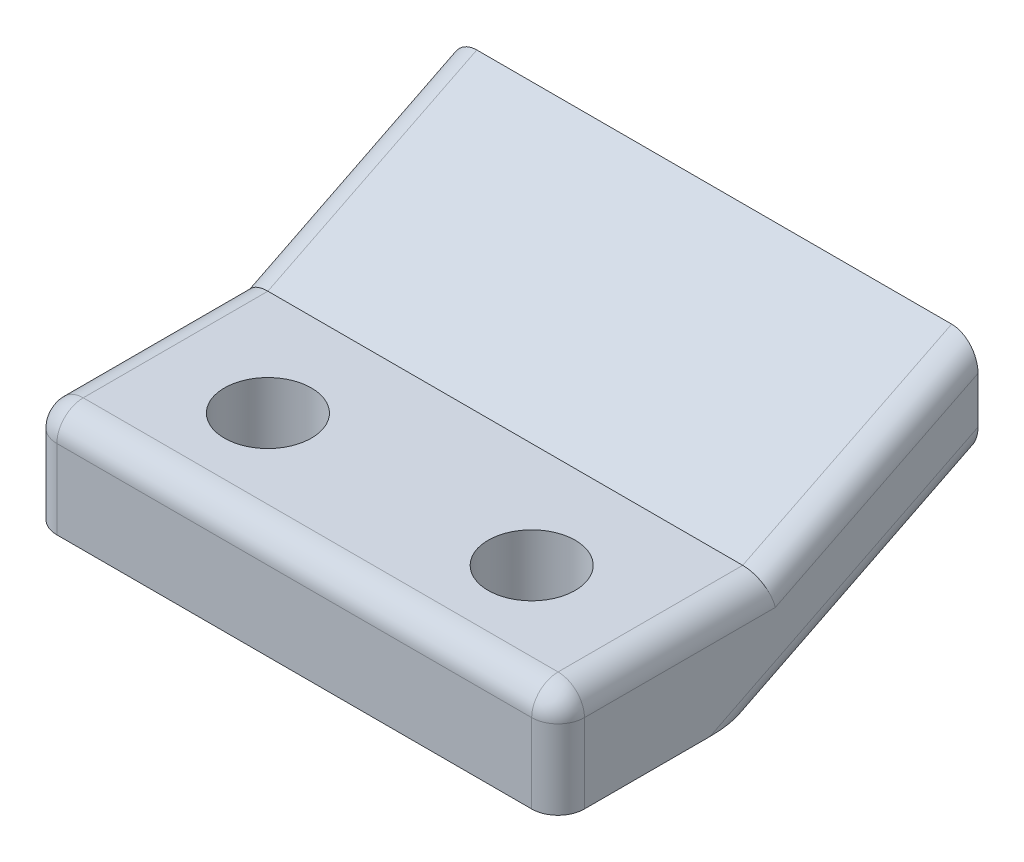
ISO-10303-21;
HEADER;
FILE_DESCRIPTION(('STEP AP214'),'2;1');
FILE_NAME('part.step','',(''),(''),'','','');
FILE_SCHEMA(('AUTOMOTIVE_DESIGN { 1 0 10303 214 1 1 1 1 }'));
ENDSEC;
DATA;
#1=APPLICATION_CONTEXT('core data for automotive mechanical design processes');
#2=APPLICATION_PROTOCOL_DEFINITION('international standard','automotive_design',2000,#1);
#3=PRODUCT_CONTEXT('',#1,'mechanical');
#4=PRODUCT('Part','Part','',(#3));
#5=PRODUCT_RELATED_PRODUCT_CATEGORY('part','',(#4));
#6=PRODUCT_DEFINITION_FORMATION('','',#4);
#7=PRODUCT_DEFINITION_CONTEXT('part definition',#1,'design');
#8=PRODUCT_DEFINITION('design','',#6,#7);
#9=PRODUCT_DEFINITION_SHAPE('','',#8);
#10=(LENGTH_UNIT() NAMED_UNIT(*) SI_UNIT(.MILLI.,.METRE.));
#11=(NAMED_UNIT(*) PLANE_ANGLE_UNIT() SI_UNIT($,.RADIAN.));
#12=(NAMED_UNIT(*) SI_UNIT($,.STERADIAN.) SOLID_ANGLE_UNIT());
#13=UNCERTAINTY_MEASURE_WITH_UNIT(LENGTH_MEASURE(1.E-05),#10,'distance_accuracy_value','');
#14=(GEOMETRIC_REPRESENTATION_CONTEXT(3) GLOBAL_UNCERTAINTY_ASSIGNED_CONTEXT((#13)) GLOBAL_UNIT_ASSIGNED_CONTEXT((#10,
#11,#12)) REPRESENTATION_CONTEXT('',''));
#15=CARTESIAN_POINT('',(0.,0.,0.));
#16=DIRECTION('',(0.,0.,1.));
#17=DIRECTION('',(1.,0.,0.));
#18=AXIS2_PLACEMENT_3D('',#15,#16,#17);
#19=CARTESIAN_POINT('',(20.,0.,0.));
#20=DIRECTION('',(0.,-0.894427190999916,-0.447213595499958));
#21=DIRECTION('',(0.,0.447213595499958,-0.894427190999916));
#22=AXIS2_PLACEMENT_3D('',#19,#20,#21);
#23=PLANE('',#22);
#24=DIRECTION('',(1.,0.,0.));
#25=VECTOR('',#24,1.);
#26=CARTESIAN_POINT('',(0.,4.,-8.));
#27=LINE('',#26,#25);
#28=CARTESIAN_POINT('',(1.,4.,-8.));
#29=VERTEX_POINT('',#28);
#30=CARTESIAN_POINT('',(19.,4.,-8.));
#31=VERTEX_POINT('',#30);
#32=EDGE_CURVE('E221',#29,#31,#27,.T.);
#33=ORIENTED_EDGE('',*,*,#32,.T.);
#34=DIRECTION('',(0.,-0.447213595499958,0.894427190999916));
#35=VECTOR('',#34,1.);
#36=CARTESIAN_POINT('',(19.,7.96,-15.92));
#37=LINE('',#36,#35);
#38=CARTESIAN_POINT('',(19.,7.96,-15.92));
#39=VERTEX_POINT('',#38);
#40=EDGE_CURVE('E176',#31,#39,#37,.F.);
#41=ORIENTED_EDGE('',*,*,#40,.T.);
#42=DIRECTION('',(-1.,0.,0.));
#43=VECTOR('',#42,1.);
#44=CARTESIAN_POINT('',(20.,7.96,-15.92));
#45=LINE('',#44,#43);
#46=CARTESIAN_POINT('',(1.,7.96,-15.92));
#47=VERTEX_POINT('',#46);
#48=EDGE_CURVE('E234',#39,#47,#45,.T.);
#49=ORIENTED_EDGE('',*,*,#48,.T.);
#50=DIRECTION('',(0.,-0.447213595499958,0.894427190999916));
#51=VECTOR('',#50,1.);
#52=CARTESIAN_POINT('',(1.,0.,0.));
#53=LINE('',#52,#51);
#54=EDGE_CURVE('E174',#47,#29,#53,.T.);
#55=ORIENTED_EDGE('',*,*,#54,.T.);
#56=EDGE_LOOP('',(#33,#41,#49,#55));
#57=FACE_BOUND('',#56,.T.);
#58=ADVANCED_FACE('F37',(#57),#23,.F.);
#59=CARTESIAN_POINT('',(20.,0.,-8.));
#60=DIRECTION('',(0.,1.,0.));
#61=DIRECTION('',(0.,0.,1.));
#62=AXIS2_PLACEMENT_3D('',#59,#60,#61);
#63=PLANE('',#62);
#64=CARTESIAN_POINT('',(5.,0.,-4.));
#65=DIRECTION('',(0.,-1.,0.));
#66=DIRECTION('',(0.,0.,-1.));
#67=AXIS2_PLACEMENT_3D('',#64,#65,#66);
#68=CIRCLE('',#67,1.65);
#69=CARTESIAN_POINT('',(5.,0.,-5.65));
#70=VERTEX_POINT('',#69);
#71=EDGE_CURVE('E213',#70,#70,#68,.T.);
#72=ORIENTED_EDGE('',*,*,#71,.F.);
#73=EDGE_LOOP('',(#72));
#74=FACE_BOUND('',#73,.T.);
#75=CARTESIAN_POINT('',(15.,0.,-4.));
#76=DIRECTION('',(0.,-1.,0.));
#77=DIRECTION('',(0.,0.,-1.));
#78=AXIS2_PLACEMENT_3D('',#75,#76,#77);
#79=CIRCLE('',#78,1.65);
#80=CARTESIAN_POINT('',(15.,0.,-5.65));
#81=VERTEX_POINT('',#80);
#82=EDGE_CURVE('E207',#81,#81,#79,.T.);
#83=ORIENTED_EDGE('',*,*,#82,.F.);
#84=EDGE_LOOP('',(#83));
#85=FACE_BOUND('',#84,.T.);
#86=DIRECTION('',(-1.,0.,0.));
#87=VECTOR('',#86,1.);
#88=CARTESIAN_POINT('',(20.,0.,-8.));
#89=LINE('',#88,#87);
#90=CARTESIAN_POINT('',(19.,0.,-8.));
#91=VERTEX_POINT('',#90);
#92=CARTESIAN_POINT('',(1.,0.,-8.));
#93=VERTEX_POINT('',#92);
#94=EDGE_CURVE('E144',#91,#93,#89,.T.);
#95=ORIENTED_EDGE('',*,*,#94,.F.);
#96=CARTESIAN_POINT('',(19.,0.,-5.76393202250021));
#97=DIRECTION('',(0.,1.,0.));
#98=DIRECTION('',(0.,0.,1.));
#99=AXIS2_PLACEMENT_3D('',#96,#97,#98);
#100=ELLIPSE('',#99,2.23606797749979,1.);
#101=CARTESIAN_POINT('',(20.,0.,-5.76393202250021));
#102=VERTEX_POINT('',#101);
#103=EDGE_CURVE('E152',#91,#102,#100,.F.);
#104=ORIENTED_EDGE('',*,*,#103,.T.);
#105=DIRECTION('',(0.,0.,-1.));
#106=VECTOR('',#105,1.);
#107=CARTESIAN_POINT('',(20.,0.,-8.));
#108=LINE('',#107,#106);
#109=CARTESIAN_POINT('',(20.,0.,-1.));
#110=VERTEX_POINT('',#109);
#111=EDGE_CURVE('E135',#110,#102,#108,.T.);
#112=ORIENTED_EDGE('',*,*,#111,.F.);
#113=CARTESIAN_POINT('',(19.,0.,-1.));
#114=DIRECTION('',(0.,1.,0.));
#115=DIRECTION('',(0.,0.,1.));
#116=AXIS2_PLACEMENT_3D('',#113,#114,#115);
#117=CIRCLE('',#116,1.);
#118=CARTESIAN_POINT('',(19.,0.,0.));
#119=VERTEX_POINT('',#118);
#120=EDGE_CURVE('E150',#110,#119,#117,.F.);
#121=ORIENTED_EDGE('',*,*,#120,.T.);
#122=DIRECTION('',(-1.,0.,0.));
#123=VECTOR('',#122,1.);
#124=CARTESIAN_POINT('',(20.,0.,0.));
#125=LINE('',#124,#123);
#126=CARTESIAN_POINT('',(1.,0.,0.));
#127=VERTEX_POINT('',#126);
#128=EDGE_CURVE('E228',#119,#127,#125,.T.);
#129=ORIENTED_EDGE('',*,*,#128,.T.);
#130=CARTESIAN_POINT('',(1.,0.,-1.));
#131=DIRECTION('',(0.,1.,0.));
#132=DIRECTION('',(0.,0.,1.));
#133=AXIS2_PLACEMENT_3D('',#130,#131,#132);
#134=CIRCLE('',#133,1.);
#135=CARTESIAN_POINT('',(0.,0.,-1.));
#136=VERTEX_POINT('',#135);
#137=EDGE_CURVE('E158',#127,#136,#134,.F.);
#138=ORIENTED_EDGE('',*,*,#137,.T.);
#139=DIRECTION('',(0.,0.,-1.));
#140=VECTOR('',#139,1.);
#141=CARTESIAN_POINT('',(0.,0.,-8.));
#142=LINE('',#141,#140);
#143=CARTESIAN_POINT('',(0.,0.,-5.76393202250021));
#144=VERTEX_POINT('',#143);
#145=EDGE_CURVE('E223',#136,#144,#142,.T.);
#146=ORIENTED_EDGE('',*,*,#145,.T.);
#147=CARTESIAN_POINT('',(1.,0.,-5.76393202250021));
#148=DIRECTION('',(0.,1.,0.));
#149=DIRECTION('',(0.,0.,-1.));
#150=AXIS2_PLACEMENT_3D('',#147,#148,#149);
#151=ELLIPSE('',#150,2.23606797749979,1.);
#152=EDGE_CURVE('E157',#144,#93,#151,.F.);
#153=ORIENTED_EDGE('',*,*,#152,.T.);
#154=EDGE_LOOP('',(#95,#104,#112,#121,#129,#138,#146,#153));
#155=FACE_BOUND('',#154,.T.);
#156=ADVANCED_FACE('F148',(#74,#85,#155),#63,.F.);
#157=CARTESIAN_POINT('',(20.,3.96,-15.92));
#158=DIRECTION('',(0.,0.894427190999916,0.447213595499958));
#159=DIRECTION('',(0.,-0.447213595499958,0.894427190999916));
#160=AXIS2_PLACEMENT_3D('',#157,#158,#159);
#161=PLANE('',#160);
#162=DIRECTION('',(-1.,0.,0.));
#163=VECTOR('',#162,1.);
#164=CARTESIAN_POINT('',(20.,3.96,-15.92));
#165=LINE('',#164,#163);
#166=CARTESIAN_POINT('',(19.,3.96,-15.92));
#167=VERTEX_POINT('',#166);
#168=CARTESIAN_POINT('',(1.,3.96,-15.92));
#169=VERTEX_POINT('',#168);
#170=EDGE_CURVE('E237',#167,#169,#165,.T.);
#171=ORIENTED_EDGE('',*,*,#170,.F.);
#172=DIRECTION('',(0.,0.447213595499958,-0.894427190999916));
#173=VECTOR('',#172,1.);
#174=CARTESIAN_POINT('',(19.,0.,-8.));
#175=LINE('',#174,#173);
#176=EDGE_CURVE('E161',#167,#91,#175,.F.);
#177=ORIENTED_EDGE('',*,*,#176,.T.);
#178=ORIENTED_EDGE('',*,*,#94,.T.);
#179=DIRECTION('',(0.,0.447213595499958,-0.894427190999916));
#180=VECTOR('',#179,1.);
#181=CARTESIAN_POINT('',(1.,3.96,-15.92));
#182=LINE('',#181,#180);
#183=EDGE_CURVE('E259',#93,#169,#182,.T.);
#184=ORIENTED_EDGE('',*,*,#183,.T.);
#185=EDGE_LOOP('',(#171,#177,#178,#184));
#186=FACE_BOUND('',#185,.T.);
#187=ADVANCED_FACE('F264',(#186),#161,.F.);
#188=CARTESIAN_POINT('',(20.,7.96,-15.92));
#189=DIRECTION('',(0.,0.,1.));
#190=DIRECTION('',(0.,-1.,0.));
#191=AXIS2_PLACEMENT_3D('',#188,#189,#190);
#192=PLANE('',#191);
#193=DIRECTION('',(0.,1.,0.));
#194=VECTOR('',#193,1.);
#195=CARTESIAN_POINT('',(20.,7.96,-15.92));
#196=LINE('',#195,#194);
#197=CARTESIAN_POINT('',(20.,5.0780339887499,-15.92));
#198=VERTEX_POINT('',#197);
#199=CARTESIAN_POINT('',(20.,6.84196601125011,-15.92));
#200=VERTEX_POINT('',#199);
#201=EDGE_CURVE('E153',#198,#200,#196,.T.);
#202=ORIENTED_EDGE('',*,*,#201,.F.);
#203=CARTESIAN_POINT('',(19.,5.0780339887499,-15.92));
#204=DIRECTION('',(0.,0.,1.));
#205=DIRECTION('',(0.,-1.,0.));
#206=AXIS2_PLACEMENT_3D('',#203,#204,#205);
#207=ELLIPSE('',#206,1.11803398874989,1.);
#208=EDGE_CURVE('E257',#198,#167,#207,.F.);
#209=ORIENTED_EDGE('',*,*,#208,.T.);
#210=ORIENTED_EDGE('',*,*,#170,.T.);
#211=CARTESIAN_POINT('',(1.,5.0780339887499,-15.92));
#212=DIRECTION('',(0.,0.,1.));
#213=DIRECTION('',(0.,1.,0.));
#214=AXIS2_PLACEMENT_3D('',#211,#212,#213);
#215=ELLIPSE('',#214,1.11803398874989,1.);
#216=CARTESIAN_POINT('',(0.,5.0780339887499,-15.92));
#217=VERTEX_POINT('',#216);
#218=EDGE_CURVE('E255',#169,#217,#215,.F.);
#219=ORIENTED_EDGE('',*,*,#218,.T.);
#220=DIRECTION('',(0.,1.,0.));
#221=VECTOR('',#220,1.);
#222=CARTESIAN_POINT('',(0.,7.96,-15.92));
#223=LINE('',#222,#221);
#224=CARTESIAN_POINT('',(0.,6.84196601125011,-15.92));
#225=VERTEX_POINT('',#224);
#226=EDGE_CURVE('E154',#217,#225,#223,.T.);
#227=ORIENTED_EDGE('',*,*,#226,.T.);
#228=CARTESIAN_POINT('',(1.,6.84196601125011,-15.92));
#229=DIRECTION('',(0.,0.,1.));
#230=DIRECTION('',(0.,-1.,0.));
#231=AXIS2_PLACEMENT_3D('',#228,#229,#230);
#232=ELLIPSE('',#231,1.11803398874989,1.);
#233=EDGE_CURVE('E251',#225,#47,#232,.F.);
#234=ORIENTED_EDGE('',*,*,#233,.T.);
#235=ORIENTED_EDGE('',*,*,#48,.F.);
#236=CARTESIAN_POINT('',(19.,6.84196601125011,-15.92));
#237=DIRECTION('',(0.,0.,1.));
#238=DIRECTION('',(0.,1.,0.));
#239=AXIS2_PLACEMENT_3D('',#236,#237,#238);
#240=ELLIPSE('',#239,1.11803398874989,1.);
#241=EDGE_CURVE('E253',#39,#200,#240,.F.);
#242=ORIENTED_EDGE('',*,*,#241,.T.);
#243=EDGE_LOOP('',(#202,#209,#210,#219,#227,#234,#235,#242));
#244=FACE_BOUND('',#243,.T.);
#245=ADVANCED_FACE('F272',(#244),#192,.F.);
#246=CARTESIAN_POINT('',(20.,0.,0.));
#247=DIRECTION('',(1.,0.,0.));
#248=DIRECTION('',(0.,0.,-1.));
#249=AXIS2_PLACEMENT_3D('',#246,#247,#248);
#250=PLANE('',#249);
#251=ORIENTED_EDGE('',*,*,#111,.T.);
#252=DIRECTION('',(0.,0.447213595499958,-0.894427190999916));
#253=VECTOR('',#252,1.);
#254=CARTESIAN_POINT('',(20.,4.85442719099992,-15.4727864045001));
#255=LINE('',#254,#253);
#256=EDGE_CURVE('E249',#102,#198,#255,.T.);
#257=ORIENTED_EDGE('',*,*,#256,.T.);
#258=ORIENTED_EDGE('',*,*,#201,.T.);
#259=DIRECTION('',(0.,-0.447213595499958,0.894427190999916));
#260=VECTOR('',#259,1.);
#261=CARTESIAN_POINT('',(20.,3.10557280900008,-8.44721359549996));
#262=LINE('',#261,#260);
#263=CARTESIAN_POINT('',(20.,3.,-8.23606797749979));
#264=VERTEX_POINT('',#263);
#265=EDGE_CURVE('E247',#200,#264,#262,.T.);
#266=ORIENTED_EDGE('',*,*,#265,.T.);
#267=DIRECTION('',(0.,0.,1.));
#268=VECTOR('',#267,1.);
#269=CARTESIAN_POINT('',(20.,3.,0.));
#270=LINE('',#269,#268);
#271=CARTESIAN_POINT('',(20.,3.,-1.));
#272=VERTEX_POINT('',#271);
#273=EDGE_CURVE('E139',#264,#272,#270,.T.);
#274=ORIENTED_EDGE('',*,*,#273,.T.);
#275=DIRECTION('',(0.,-1.,0.));
#276=VECTOR('',#275,1.);
#277=CARTESIAN_POINT('',(20.,0.,-1.));
#278=LINE('',#277,#276);
#279=EDGE_CURVE('E131',#272,#110,#278,.T.);
#280=ORIENTED_EDGE('',*,*,#279,.T.);
#281=EDGE_LOOP('',(#251,#257,#258,#266,#274,#280));
#282=FACE_BOUND('',#281,.T.);
#283=ADVANCED_FACE('F133',(#282),#250,.T.);
#284=CARTESIAN_POINT('',(0.,0.,0.));
#285=DIRECTION('',(1.,0.,0.));
#286=DIRECTION('',(0.,0.,-1.));
#287=AXIS2_PLACEMENT_3D('',#284,#285,#286);
#288=PLANE('',#287);
#289=ORIENTED_EDGE('',*,*,#226,.F.);
#290=DIRECTION('',(0.,0.447213595499958,-0.894427190999916));
#291=VECTOR('',#290,1.);
#292=CARTESIAN_POINT('',(0.,-2.30557280900008,-1.15278640450004));
#293=LINE('',#292,#291);
#294=EDGE_CURVE('E172',#217,#144,#293,.F.);
#295=ORIENTED_EDGE('',*,*,#294,.T.);
#296=ORIENTED_EDGE('',*,*,#145,.F.);
#297=DIRECTION('',(0.,-1.,0.));
#298=VECTOR('',#297,1.);
#299=CARTESIAN_POINT('',(0.,4.,-1.));
#300=LINE('',#299,#298);
#301=CARTESIAN_POINT('',(0.,3.,-1.));
#302=VERTEX_POINT('',#301);
#303=EDGE_CURVE('E166',#136,#302,#300,.F.);
#304=ORIENTED_EDGE('',*,*,#303,.T.);
#305=DIRECTION('',(0.,0.,-1.));
#306=VECTOR('',#305,1.);
#307=CARTESIAN_POINT('',(0.,3.,0.));
#308=LINE('',#307,#306);
#309=CARTESIAN_POINT('',(0.,3.,-8.23606797749979));
#310=VERTEX_POINT('',#309);
#311=EDGE_CURVE('E168',#302,#310,#308,.T.);
#312=ORIENTED_EDGE('',*,*,#311,.T.);
#313=DIRECTION('',(0.,-0.447213595499958,0.894427190999916));
#314=VECTOR('',#313,1.);
#315=CARTESIAN_POINT('',(0.,-0.894427190999915,-0.447213595499958));
#316=LINE('',#315,#314);
#317=EDGE_CURVE('E170',#310,#225,#316,.F.);
#318=ORIENTED_EDGE('',*,*,#317,.T.);
#319=EDGE_LOOP('',(#289,#295,#296,#304,#312,#318));
#320=FACE_BOUND('',#319,.T.);
#321=ADVANCED_FACE('F301',(#320),#288,.F.);
#322=CARTESIAN_POINT('',(0.,4.,0.));
#323=DIRECTION('',(0.,0.,1.));
#324=DIRECTION('',(0.,-1.,0.));
#325=AXIS2_PLACEMENT_3D('',#322,#323,#324);
#326=PLANE('',#325);
#327=ORIENTED_EDGE('',*,*,#128,.F.);
#328=DIRECTION('',(0.,-1.,0.));
#329=VECTOR('',#328,1.);
#330=CARTESIAN_POINT('',(19.,4.,0.));
#331=LINE('',#330,#329);
#332=CARTESIAN_POINT('',(19.,3.,0.));
#333=VERTEX_POINT('',#332);
#334=EDGE_CURVE('E11',#119,#333,#331,.F.);
#335=ORIENTED_EDGE('',*,*,#334,.T.);
#336=DIRECTION('',(-1.,0.,0.));
#337=VECTOR('',#336,1.);
#338=CARTESIAN_POINT('',(0.,3.,0.));
#339=LINE('',#338,#337);
#340=CARTESIAN_POINT('',(1.,3.,0.));
#341=VERTEX_POINT('',#340);
#342=EDGE_CURVE('E53',#333,#341,#339,.T.);
#343=ORIENTED_EDGE('',*,*,#342,.T.);
#344=DIRECTION('',(0.,-1.,0.));
#345=VECTOR('',#344,1.);
#346=CARTESIAN_POINT('',(1.,0.,0.));
#347=LINE('',#346,#345);
#348=EDGE_CURVE('E46',#341,#127,#347,.T.);
#349=ORIENTED_EDGE('',*,*,#348,.T.);
#350=EDGE_LOOP('',(#327,#335,#343,#349));
#351=FACE_BOUND('',#350,.T.);
#352=ADVANCED_FACE('F298',(#351),#326,.T.);
#353=CARTESIAN_POINT('',(0.,4.,0.));
#354=DIRECTION('',(0.,-1.,0.));
#355=DIRECTION('',(0.,0.,-1.));
#356=AXIS2_PLACEMENT_3D('',#353,#354,#355);
#357=PLANE('',#356);
#358=CARTESIAN_POINT('',(5.,4.,-4.));
#359=DIRECTION('',(0.,-1.,0.));
#360=DIRECTION('',(0.,0.,-1.));
#361=AXIS2_PLACEMENT_3D('',#358,#359,#360);
#362=CIRCLE('',#361,1.65);
#363=CARTESIAN_POINT('',(5.,4.,-5.65));
#364=VERTEX_POINT('',#363);
#365=EDGE_CURVE('E224',#364,#364,#362,.T.);
#366=ORIENTED_EDGE('',*,*,#365,.T.);
#367=EDGE_LOOP('',(#366));
#368=FACE_BOUND('',#367,.T.);
#369=CARTESIAN_POINT('',(15.,4.,-4.));
#370=DIRECTION('',(0.,-1.,0.));
#371=DIRECTION('',(0.,0.,-1.));
#372=AXIS2_PLACEMENT_3D('',#369,#370,#371);
#373=CIRCLE('',#372,1.65);
#374=CARTESIAN_POINT('',(15.,4.,-5.65));
#375=VERTEX_POINT('',#374);
#376=EDGE_CURVE('E218',#375,#375,#373,.T.);
#377=ORIENTED_EDGE('',*,*,#376,.T.);
#378=EDGE_LOOP('',(#377));
#379=FACE_BOUND('',#378,.T.);
#380=DIRECTION('',(-1.,0.,0.));
#381=VECTOR('',#380,1.);
#382=CARTESIAN_POINT('',(20.,4.,-1.));
#383=LINE('',#382,#381);
#384=CARTESIAN_POINT('',(1.,4.,-1.));
#385=VERTEX_POINT('',#384);
#386=CARTESIAN_POINT('',(19.,4.,-1.));
#387=VERTEX_POINT('',#386);
#388=EDGE_CURVE('E178',#385,#387,#383,.F.);
#389=ORIENTED_EDGE('',*,*,#388,.T.);
#390=DIRECTION('',(0.,0.,1.));
#391=VECTOR('',#390,1.);
#392=CARTESIAN_POINT('',(19.,4.,-8.));
#393=LINE('',#392,#391);
#394=EDGE_CURVE('E182',#387,#31,#393,.F.);
#395=ORIENTED_EDGE('',*,*,#394,.T.);
#396=ORIENTED_EDGE('',*,*,#32,.F.);
#397=DIRECTION('',(0.,0.,-1.));
#398=VECTOR('',#397,1.);
#399=CARTESIAN_POINT('',(1.,4.,0.));
#400=LINE('',#399,#398);
#401=EDGE_CURVE('E180',#29,#385,#400,.F.);
#402=ORIENTED_EDGE('',*,*,#401,.T.);
#403=EDGE_LOOP('',(#389,#395,#396,#402));
#404=FACE_BOUND('',#403,.T.);
#405=ADVANCED_FACE('F311',(#368,#379,#404),#357,.F.);
#406=CARTESIAN_POINT('',(15.,7.96,-4.));
#407=DIRECTION('',(0.,-1.,0.));
#408=DIRECTION('',(0.,0.,-1.));
#409=AXIS2_PLACEMENT_3D('',#406,#407,#408);
#410=CYLINDRICAL_SURFACE('',#409,1.65);
#411=ORIENTED_EDGE('',*,*,#82,.T.);
#412=EDGE_LOOP('',(#411));
#413=FACE_BOUND('',#412,.T.);
#414=ORIENTED_EDGE('',*,*,#376,.F.);
#415=EDGE_LOOP('',(#414));
#416=FACE_BOUND('',#415,.T.);
#417=ADVANCED_FACE('F313',(#413,#416),#410,.F.);
#418=CARTESIAN_POINT('',(5.,7.96,-4.));
#419=DIRECTION('',(0.,-1.,0.));
#420=DIRECTION('',(0.,0.,-1.));
#421=AXIS2_PLACEMENT_3D('',#418,#419,#420);
#422=CYLINDRICAL_SURFACE('',#421,1.65);
#423=ORIENTED_EDGE('',*,*,#71,.T.);
#424=EDGE_LOOP('',(#423));
#425=FACE_BOUND('',#424,.T.);
#426=ORIENTED_EDGE('',*,*,#365,.F.);
#427=EDGE_LOOP('',(#426));
#428=FACE_BOUND('',#427,.T.);
#429=ADVANCED_FACE('F320',(#425,#428),#422,.F.);
#430=CARTESIAN_POINT('',(19.,-2.30557280900008,-1.15278640450004));
#431=DIRECTION('',(0.,-0.447213595499958,0.894427190999916));
#432=DIRECTION('',(0.,-0.894427190999916,-0.447213595499958));
#433=AXIS2_PLACEMENT_3D('',#430,#431,#432);
#434=CYLINDRICAL_SURFACE('',#433,1.);
#435=ORIENTED_EDGE('',*,*,#103,.F.);
#436=ORIENTED_EDGE('',*,*,#176,.F.);
#437=ORIENTED_EDGE('',*,*,#208,.F.);
#438=ORIENTED_EDGE('',*,*,#256,.F.);
#439=EDGE_LOOP('',(#435,#436,#437,#438));
#440=FACE_BOUND('',#439,.T.);
#441=ADVANCED_FACE('F268',(#440),#434,.T.);
#442=CARTESIAN_POINT('',(1.,4.85442719099992,-15.4727864045));
#443=DIRECTION('',(0.,0.447213595499958,-0.894427190999916));
#444=DIRECTION('',(0.,0.894427190999916,0.447213595499958));
#445=AXIS2_PLACEMENT_3D('',#442,#443,#444);
#446=CYLINDRICAL_SURFACE('',#445,1.);
#447=ORIENTED_EDGE('',*,*,#152,.F.);
#448=ORIENTED_EDGE('',*,*,#294,.F.);
#449=ORIENTED_EDGE('',*,*,#218,.F.);
#450=ORIENTED_EDGE('',*,*,#183,.F.);
#451=EDGE_LOOP('',(#447,#448,#449,#450));
#452=FACE_BOUND('',#451,.T.);
#453=ADVANCED_FACE('F304',(#452),#446,.T.);
#454=CARTESIAN_POINT('',(1.,-0.894427190999916,-0.447213595499958));
#455=DIRECTION('',(0.,-0.447213595499958,0.894427190999916));
#456=DIRECTION('',(0.,-0.894427190999916,-0.447213595499958));
#457=AXIS2_PLACEMENT_3D('',#454,#455,#456);
#458=CYLINDRICAL_SURFACE('',#457,1.);
#459=ORIENTED_EDGE('',*,*,#233,.F.);
#460=ORIENTED_EDGE('',*,*,#317,.F.);
#461=CARTESIAN_POINT('',(1.,3.,-8.23606797749979));
#462=DIRECTION('',(0.,-0.229752920547361,0.97324898946773));
#463=DIRECTION('',(0.,-0.97324898946773,-0.229752920547361));
#464=AXIS2_PLACEMENT_3D('',#461,#462,#463);
#465=ELLIPSE('',#464,1.02748629674602,1.);
#466=EDGE_CURVE('E41',#29,#310,#465,.T.);
#467=ORIENTED_EDGE('',*,*,#466,.F.);
#468=ORIENTED_EDGE('',*,*,#54,.F.);
#469=EDGE_LOOP('',(#459,#460,#467,#468));
#470=FACE_BOUND('',#469,.T.);
#471=ADVANCED_FACE('F39',(#470),#458,.T.);
#472=CARTESIAN_POINT('',(1.,4.,-1.));
#473=DIRECTION('',(0.,1.,0.));
#474=DIRECTION('',(0.,0.,1.));
#475=AXIS2_PLACEMENT_3D('',#472,#473,#474);
#476=CYLINDRICAL_SURFACE('',#475,1.);
#477=ORIENTED_EDGE('',*,*,#137,.F.);
#478=ORIENTED_EDGE('',*,*,#348,.F.);
#479=CARTESIAN_POINT('',(1.,3.,-1.));
#480=DIRECTION('',(0.,1.,0.));
#481=DIRECTION('',(0.,0.,1.));
#482=AXIS2_PLACEMENT_3D('',#479,#480,#481);
#483=CIRCLE('',#482,1.);
#484=EDGE_CURVE('E201',#302,#341,#483,.T.);
#485=ORIENTED_EDGE('',*,*,#484,.F.);
#486=ORIENTED_EDGE('',*,*,#303,.F.);
#487=EDGE_LOOP('',(#477,#478,#485,#486));
#488=FACE_BOUND('',#487,.T.);
#489=ADVANCED_FACE('F297',(#488),#476,.T.);
#490=CARTESIAN_POINT('',(1.,3.,0.));
#491=DIRECTION('',(0.,0.,-1.));
#492=DIRECTION('',(0.,1.,0.));
#493=AXIS2_PLACEMENT_3D('',#490,#491,#492);
#494=CYLINDRICAL_SURFACE('',#493,1.);
#495=ORIENTED_EDGE('',*,*,#466,.T.);
#496=ORIENTED_EDGE('',*,*,#311,.F.);
#497=CARTESIAN_POINT('',(1.,3.,-1.));
#498=DIRECTION('',(0.,0.,1.));
#499=DIRECTION('',(1.,0.,0.));
#500=AXIS2_PLACEMENT_3D('',#497,#498,#499);
#501=CIRCLE('',#500,1.);
#502=EDGE_CURVE('E199',#385,#302,#501,.T.);
#503=ORIENTED_EDGE('',*,*,#502,.F.);
#504=ORIENTED_EDGE('',*,*,#401,.F.);
#505=EDGE_LOOP('',(#495,#496,#503,#504));
#506=FACE_BOUND('',#505,.T.);
#507=ADVANCED_FACE('F291',(#506),#494,.T.);
#508=CARTESIAN_POINT('',(1.,3.,-1.));
#509=DIRECTION('',(-1.,0.,0.));
#510=DIRECTION('',(0.,0.,1.));
#511=AXIS2_PLACEMENT_3D('',#508,#509,#510);
#512=SPHERICAL_SURFACE('',#511,1.);
#513=ORIENTED_EDGE('',*,*,#502,.T.);
#514=ORIENTED_EDGE('',*,*,#484,.T.);
#515=CARTESIAN_POINT('',(1.,3.,-1.));
#516=DIRECTION('',(-1.,0.,0.));
#517=DIRECTION('',(0.,0.,1.));
#518=AXIS2_PLACEMENT_3D('',#515,#516,#517);
#519=CIRCLE('',#518,1.);
#520=EDGE_CURVE('E196',#385,#341,#519,.F.);
#521=ORIENTED_EDGE('',*,*,#520,.F.);
#522=EDGE_LOOP('',(#513,#514,#521));
#523=FACE_BOUND('',#522,.T.);
#524=ADVANCED_FACE('F289',(#523),#512,.T.);
#525=CARTESIAN_POINT('',(19.,0.,-1.));
#526=DIRECTION('',(0.,-1.,0.));
#527=DIRECTION('',(0.,0.,-1.));
#528=AXIS2_PLACEMENT_3D('',#525,#526,#527);
#529=CYLINDRICAL_SURFACE('',#528,1.);
#530=ORIENTED_EDGE('',*,*,#120,.F.);
#531=ORIENTED_EDGE('',*,*,#279,.F.);
#532=CARTESIAN_POINT('',(19.,3.,-1.));
#533=DIRECTION('',(0.,1.,0.));
#534=DIRECTION('',(0.,0.,1.));
#535=AXIS2_PLACEMENT_3D('',#532,#533,#534);
#536=CIRCLE('',#535,1.);
#537=EDGE_CURVE('E194',#333,#272,#536,.T.);
#538=ORIENTED_EDGE('',*,*,#537,.F.);
#539=ORIENTED_EDGE('',*,*,#334,.F.);
#540=EDGE_LOOP('',(#530,#531,#538,#539));
#541=FACE_BOUND('',#540,.T.);
#542=ADVANCED_FACE('F156',(#541),#529,.T.);
#543=CARTESIAN_POINT('',(0.,3.,-1.));
#544=DIRECTION('',(1.,0.,0.));
#545=DIRECTION('',(0.,0.,-1.));
#546=AXIS2_PLACEMENT_3D('',#543,#544,#545);
#547=CYLINDRICAL_SURFACE('',#546,1.);
#548=ORIENTED_EDGE('',*,*,#520,.T.);
#549=ORIENTED_EDGE('',*,*,#342,.F.);
#550=CARTESIAN_POINT('',(19.,3.,-1.));
#551=DIRECTION('',(1.,0.,0.));
#552=DIRECTION('',(0.,0.,-1.));
#553=AXIS2_PLACEMENT_3D('',#550,#551,#552);
#554=CIRCLE('',#553,1.);
#555=EDGE_CURVE('E191',#387,#333,#554,.T.);
#556=ORIENTED_EDGE('',*,*,#555,.F.);
#557=ORIENTED_EDGE('',*,*,#388,.F.);
#558=EDGE_LOOP('',(#548,#549,#556,#557));
#559=FACE_BOUND('',#558,.T.);
#560=ADVANCED_FACE('F288',(#559),#547,.T.);
#561=CARTESIAN_POINT('',(19.,3.,-1.));
#562=DIRECTION('',(0.,0.,1.));
#563=DIRECTION('',(1.,0.,0.));
#564=AXIS2_PLACEMENT_3D('',#561,#562,#563);
#565=SPHERICAL_SURFACE('',#564,1.);
#566=ORIENTED_EDGE('',*,*,#555,.T.);
#567=ORIENTED_EDGE('',*,*,#537,.T.);
#568=CARTESIAN_POINT('',(19.,3.,-1.));
#569=DIRECTION('',(0.,0.,1.));
#570=DIRECTION('',(1.,0.,0.));
#571=AXIS2_PLACEMENT_3D('',#568,#569,#570);
#572=CIRCLE('',#571,1.);
#573=EDGE_CURVE('E188',#387,#272,#572,.F.);
#574=ORIENTED_EDGE('',*,*,#573,.F.);
#575=EDGE_LOOP('',(#566,#567,#574));
#576=FACE_BOUND('',#575,.T.);
#577=ADVANCED_FACE('F284',(#576),#565,.T.);
#578=CARTESIAN_POINT('',(19.,3.,0.));
#579=DIRECTION('',(0.,0.,-1.));
#580=DIRECTION('',(0.,1.,0.));
#581=AXIS2_PLACEMENT_3D('',#578,#579,#580);
#582=CYLINDRICAL_SURFACE('',#581,1.);
#583=ORIENTED_EDGE('',*,*,#573,.T.);
#584=ORIENTED_EDGE('',*,*,#273,.F.);
#585=CARTESIAN_POINT('',(19.,3.,-8.23606797749979));
#586=DIRECTION('',(0.,0.229752920547361,-0.97324898946773));
#587=DIRECTION('',(0.,0.97324898946773,0.229752920547361));
#588=AXIS2_PLACEMENT_3D('',#585,#586,#587);
#589=ELLIPSE('',#588,1.02748629674602,1.);
#590=EDGE_CURVE('E186',#31,#264,#589,.T.);
#591=ORIENTED_EDGE('',*,*,#590,.F.);
#592=ORIENTED_EDGE('',*,*,#394,.F.);
#593=EDGE_LOOP('',(#583,#584,#591,#592));
#594=FACE_BOUND('',#593,.T.);
#595=ADVANCED_FACE('F281',(#594),#582,.T.);
#596=CARTESIAN_POINT('',(19.,-0.894427190999916,-0.447213595499958));
#597=DIRECTION('',(0.,0.447213595499958,-0.894427190999916));
#598=DIRECTION('',(0.,0.894427190999916,0.447213595499958));
#599=AXIS2_PLACEMENT_3D('',#596,#597,#598);
#600=CYLINDRICAL_SURFACE('',#599,1.);
#601=ORIENTED_EDGE('',*,*,#241,.F.);
#602=ORIENTED_EDGE('',*,*,#40,.F.);
#603=ORIENTED_EDGE('',*,*,#590,.T.);
#604=ORIENTED_EDGE('',*,*,#265,.F.);
#605=EDGE_LOOP('',(#601,#602,#603,#604));
#606=FACE_BOUND('',#605,.T.);
#607=ADVANCED_FACE('F277',(#606),#600,.T.);
#608=CLOSED_SHELL('',(#58,#156,#187,#245,#283,#321,#352,#405,#417,#429,#441,#453,#471,#489,#507,
#524,#542,#560,#577,#595,#607));
#609=MANIFOLD_SOLID_BREP('B2',#608);
#610=ADVANCED_BREP_SHAPE_REPRESENTATION('',(#18,#609),#14);
#611=SHAPE_DEFINITION_REPRESENTATION(#9,#610);
ENDSEC;
END-ISO-10303-21;
